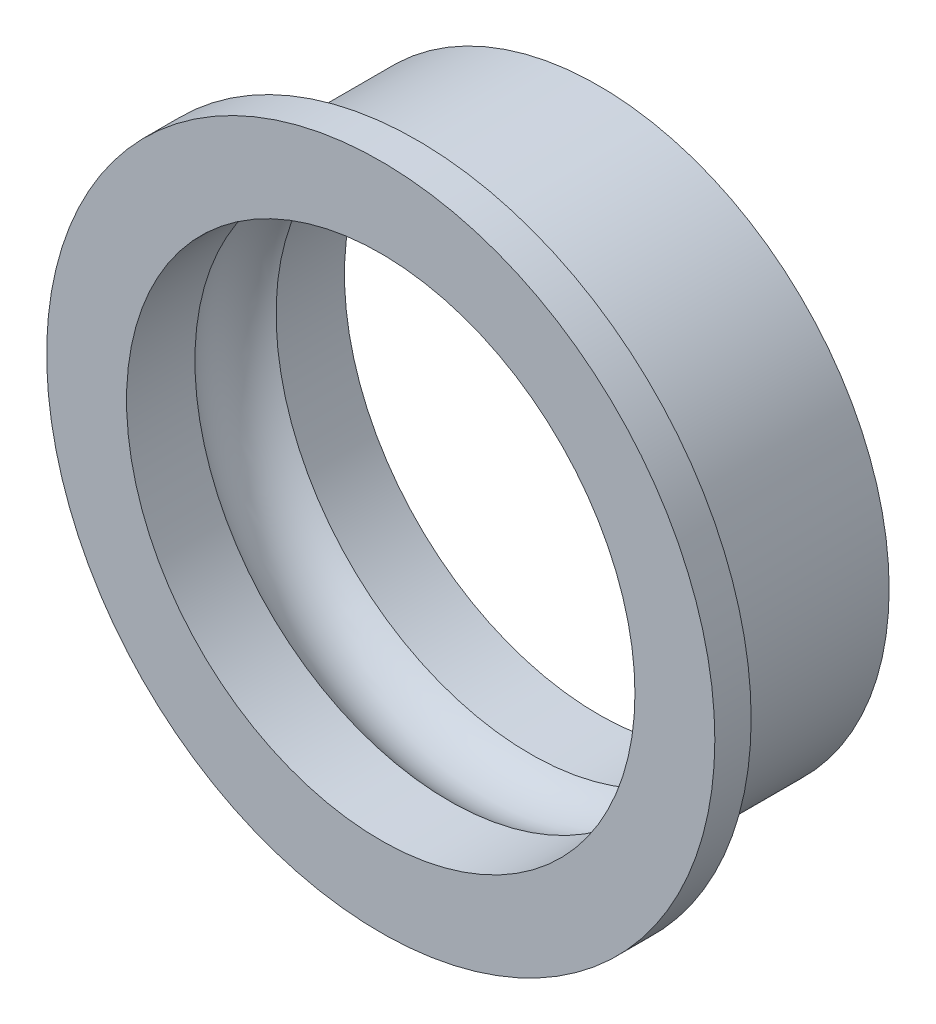
ISO-10303-21;
HEADER;
FILE_DESCRIPTION(('STEP AP214'),'2;1');
FILE_NAME('part.step','',(''),(''),'','','');
FILE_SCHEMA(('AUTOMOTIVE_DESIGN { 1 0 10303 214 1 1 1 1 }'));
ENDSEC;
DATA;
#1=APPLICATION_CONTEXT('core data for automotive mechanical design processes');
#2=APPLICATION_PROTOCOL_DEFINITION('international standard','automotive_design',2000,#1);
#3=PRODUCT_CONTEXT('',#1,'mechanical');
#4=PRODUCT('Part','Part','',(#3));
#5=PRODUCT_RELATED_PRODUCT_CATEGORY('part','',(#4));
#6=PRODUCT_DEFINITION_FORMATION('','',#4);
#7=PRODUCT_DEFINITION_CONTEXT('part definition',#1,'design');
#8=PRODUCT_DEFINITION('design','',#6,#7);
#9=PRODUCT_DEFINITION_SHAPE('','',#8);
#10=(LENGTH_UNIT() NAMED_UNIT(*) SI_UNIT(.MILLI.,.METRE.));
#11=(NAMED_UNIT(*) PLANE_ANGLE_UNIT() SI_UNIT($,.RADIAN.));
#12=(NAMED_UNIT(*) SI_UNIT($,.STERADIAN.) SOLID_ANGLE_UNIT());
#13=UNCERTAINTY_MEASURE_WITH_UNIT(LENGTH_MEASURE(1.E-05),#10,'distance_accuracy_value','');
#14=(GEOMETRIC_REPRESENTATION_CONTEXT(3) GLOBAL_UNCERTAINTY_ASSIGNED_CONTEXT((#13)) GLOBAL_UNIT_ASSIGNED_CONTEXT((#10,
#11,#12)) REPRESENTATION_CONTEXT('',''));
#15=CARTESIAN_POINT('',(0.,0.,0.));
#16=DIRECTION('',(0.,0.,1.));
#17=DIRECTION('',(1.,0.,0.));
#18=AXIS2_PLACEMENT_3D('',#15,#16,#17);
#19=CARTESIAN_POINT('',(0.,0.,1.5));
#20=DIRECTION('',(0.,0.,-1.));
#21=DIRECTION('',(-1.,0.,0.));
#22=AXIS2_PLACEMENT_3D('',#19,#20,#21);
#23=CYLINDRICAL_SURFACE('',#22,3.5);
#24=CARTESIAN_POINT('',(0.,0.,1.5));
#25=DIRECTION('',(0.,0.,1.));
#26=DIRECTION('',(1.,0.,0.));
#27=AXIS2_PLACEMENT_3D('',#24,#25,#26);
#28=CIRCLE('',#27,3.5);
#29=CARTESIAN_POINT('',(3.5,0.,1.5));
#30=VERTEX_POINT('',#29);
#31=EDGE_CURVE('E41',#30,#30,#28,.T.);
#32=ORIENTED_EDGE('',*,*,#31,.T.);
#33=EDGE_LOOP('',(#32));
#34=FACE_BOUND('',#33,.T.);
#35=CARTESIAN_POINT('',(0.,0.,0.559016994374947));
#36=DIRECTION('',(0.,0.,1.));
#37=DIRECTION('',(1.,0.,0.));
#38=AXIS2_PLACEMENT_3D('',#35,#36,#37);
#39=CIRCLE('',#38,3.5);
#40=CARTESIAN_POINT('',(3.5,0.,0.559016994374947));
#41=VERTEX_POINT('',#40);
#42=EDGE_CURVE('E54',#41,#41,#39,.T.);
#43=ORIENTED_EDGE('',*,*,#42,.F.);
#44=EDGE_LOOP('',(#43));
#45=FACE_BOUND('',#44,.T.);
#46=ADVANCED_FACE('F30',(#34,#45),#23,.F.);
#47=CARTESIAN_POINT('',(0.,0.,-1.5));
#48=DIRECTION('',(0.,0.,1.));
#49=DIRECTION('',(1.,0.,0.));
#50=AXIS2_PLACEMENT_3D('',#47,#48,#49);
#51=CIRCLE('',#50,3.5);
#52=CARTESIAN_POINT('',(3.5,0.,-1.5));
#53=VERTEX_POINT('',#52);
#54=EDGE_CURVE('E45',#53,#53,#51,.T.);
#55=ORIENTED_EDGE('',*,*,#54,.F.);
#56=EDGE_LOOP('',(#55));
#57=FACE_BOUND('',#56,.T.);
#58=CARTESIAN_POINT('',(0.,0.,-0.559016994374947));
#59=DIRECTION('',(0.,0.,1.));
#60=DIRECTION('',(1.,0.,0.));
#61=AXIS2_PLACEMENT_3D('',#58,#59,#60);
#62=CIRCLE('',#61,3.5);
#63=CARTESIAN_POINT('',(3.5,0.,-0.559016994374947));
#64=VERTEX_POINT('',#63);
#65=EDGE_CURVE('E59',#64,#64,#62,.T.);
#66=ORIENTED_EDGE('',*,*,#65,.T.);
#67=EDGE_LOOP('',(#66));
#68=FACE_BOUND('',#67,.T.);
#69=ADVANCED_FACE('F63',(#57,#68),#23,.F.);
#70=CARTESIAN_POINT('',(0.,0.,1.5));
#71=DIRECTION('',(0.,0.,-1.));
#72=DIRECTION('',(-1.,0.,0.));
#73=AXIS2_PLACEMENT_3D('',#70,#71,#72);
#74=CYLINDRICAL_SURFACE('',#73,4.);
#75=CARTESIAN_POINT('',(0.,0.,-1.5));
#76=DIRECTION('',(0.,0.,1.));
#77=DIRECTION('',(1.,0.,0.));
#78=AXIS2_PLACEMENT_3D('',#75,#76,#77);
#79=CIRCLE('',#78,4.);
#80=CARTESIAN_POINT('',(4.,0.,-1.5));
#81=VERTEX_POINT('',#80);
#82=EDGE_CURVE('E37',#81,#81,#79,.T.);
#83=ORIENTED_EDGE('',*,*,#82,.T.);
#84=EDGE_LOOP('',(#83));
#85=FACE_BOUND('',#84,.T.);
#86=CARTESIAN_POINT('',(0.,0.,1.));
#87=DIRECTION('',(0.,0.,1.));
#88=DIRECTION('',(1.,0.,0.));
#89=AXIS2_PLACEMENT_3D('',#86,#87,#88);
#90=CIRCLE('',#89,4.);
#91=CARTESIAN_POINT('',(4.,0.,1.));
#92=VERTEX_POINT('',#91);
#93=EDGE_CURVE('E10',#92,#92,#90,.T.);
#94=ORIENTED_EDGE('',*,*,#93,.F.);
#95=EDGE_LOOP('',(#94));
#96=FACE_BOUND('',#95,.T.);
#97=ADVANCED_FACE('F32',(#85,#96),#74,.T.);
#98=CARTESIAN_POINT('',(0.,0.,1.5));
#99=DIRECTION('',(0.,0.,1.));
#100=DIRECTION('',(1.,0.,0.));
#101=AXIS2_PLACEMENT_3D('',#98,#99,#100);
#102=PLANE('',#101);
#103=ORIENTED_EDGE('',*,*,#31,.F.);
#104=EDGE_LOOP('',(#103));
#105=FACE_BOUND('',#104,.T.);
#106=CARTESIAN_POINT('',(0.,0.,1.5));
#107=DIRECTION('',(0.,0.,1.));
#108=DIRECTION('',(1.,0.,0.));
#109=AXIS2_PLACEMENT_3D('',#106,#107,#108);
#110=CIRCLE('',#109,4.6);
#111=CARTESIAN_POINT('',(4.6,0.,1.5));
#112=VERTEX_POINT('',#111);
#113=EDGE_CURVE('E51',#112,#112,#110,.T.);
#114=ORIENTED_EDGE('',*,*,#113,.T.);
#115=EDGE_LOOP('',(#114));
#116=FACE_BOUND('',#115,.T.);
#117=ADVANCED_FACE('F85',(#105,#116),#102,.T.);
#118=CARTESIAN_POINT('',(0.,0.,-1.5));
#119=DIRECTION('',(0.,0.,1.));
#120=DIRECTION('',(1.,0.,0.));
#121=AXIS2_PLACEMENT_3D('',#118,#119,#120);
#122=PLANE('',#121);
#123=ORIENTED_EDGE('',*,*,#82,.F.);
#124=EDGE_LOOP('',(#123));
#125=FACE_BOUND('',#124,.T.);
#126=ORIENTED_EDGE('',*,*,#54,.T.);
#127=EDGE_LOOP('',(#126));
#128=FACE_BOUND('',#127,.T.);
#129=ADVANCED_FACE('F87',(#125,#128),#122,.F.);
#130=CARTESIAN_POINT('',(0.,0.,1.));
#131=DIRECTION('',(0.,0.,1.));
#132=DIRECTION('',(1.,0.,0.));
#133=AXIS2_PLACEMENT_3D('',#130,#131,#132);
#134=CYLINDRICAL_SURFACE('',#133,4.6);
#135=CARTESIAN_POINT('',(0.,0.,1.));
#136=DIRECTION('',(0.,0.,1.));
#137=DIRECTION('',(1.,0.,0.));
#138=AXIS2_PLACEMENT_3D('',#135,#136,#137);
#139=CIRCLE('',#138,4.6);
#140=CARTESIAN_POINT('',(4.6,0.,1.));
#141=VERTEX_POINT('',#140);
#142=EDGE_CURVE('E49',#141,#141,#139,.T.);
#143=ORIENTED_EDGE('',*,*,#142,.T.);
#144=EDGE_LOOP('',(#143));
#145=FACE_BOUND('',#144,.T.);
#146=ORIENTED_EDGE('',*,*,#113,.F.);
#147=EDGE_LOOP('',(#146));
#148=FACE_BOUND('',#147,.T.);
#149=ADVANCED_FACE('F73',(#145,#148),#134,.T.);
#150=CARTESIAN_POINT('',(0.,0.,1.));
#151=DIRECTION('',(0.,0.,1.));
#152=DIRECTION('',(1.,0.,0.));
#153=AXIS2_PLACEMENT_3D('',#150,#151,#152);
#154=PLANE('',#153);
#155=ORIENTED_EDGE('',*,*,#93,.T.);
#156=EDGE_LOOP('',(#155));
#157=FACE_BOUND('',#156,.T.);
#158=ORIENTED_EDGE('',*,*,#142,.F.);
#159=EDGE_LOOP('',(#158));
#160=FACE_BOUND('',#159,.T.);
#161=ADVANCED_FACE('F67',(#157,#160),#154,.F.);
#162=CARTESIAN_POINT('',(0.,0.,0.));
#163=DIRECTION('',(0.,0.,1.));
#164=DIRECTION('',(1.,0.,0.));
#165=AXIS2_PLACEMENT_3D('',#162,#163,#164);
#166=TOROIDAL_SURFACE('',#165,3.,0.75);
#167=ORIENTED_EDGE('',*,*,#42,.T.);
#168=EDGE_LOOP('',(#167));
#169=FACE_BOUND('',#168,.T.);
#170=ORIENTED_EDGE('',*,*,#65,.F.);
#171=EDGE_LOOP('',(#170));
#172=FACE_BOUND('',#171,.T.);
#173=ADVANCED_FACE('F65',(#169,#172),#166,.F.);
#174=CLOSED_SHELL('',(#46,#69,#97,#117,#129,#149,#161,#173));
#175=MANIFOLD_SOLID_BREP('B2',#174);
#176=ADVANCED_BREP_SHAPE_REPRESENTATION('',(#18,#175),#14);
#177=SHAPE_DEFINITION_REPRESENTATION(#9,#176);
ENDSEC;
END-ISO-10303-21;
